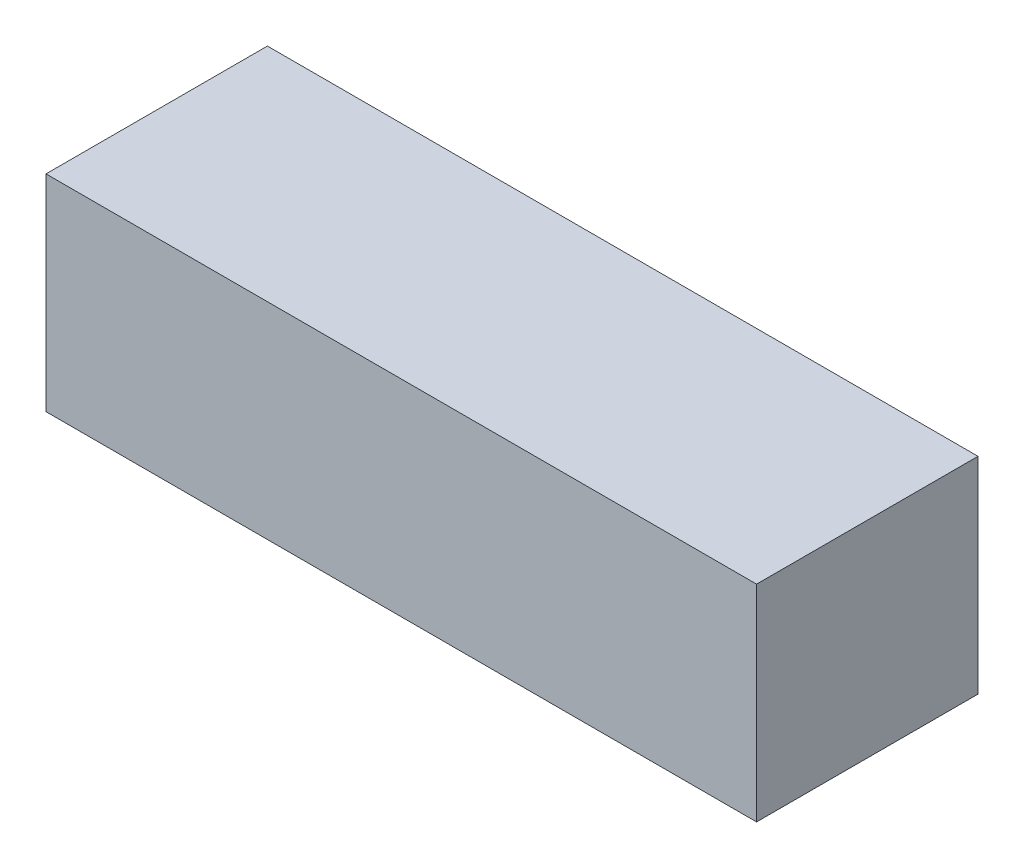
ISO-10303-21;
HEADER;
FILE_DESCRIPTION(('STEP AP214'),'2;1');
FILE_NAME('part.step','',(''),(''),'','','');
FILE_SCHEMA(('AUTOMOTIVE_DESIGN { 1 0 10303 214 1 1 1 1 }'));
ENDSEC;
DATA;
#1=APPLICATION_CONTEXT('core data for automotive mechanical design processes');
#2=APPLICATION_PROTOCOL_DEFINITION('international standard','automotive_design',2000,#1);
#3=PRODUCT_CONTEXT('',#1,'mechanical');
#4=PRODUCT('Part','Part','',(#3));
#5=PRODUCT_RELATED_PRODUCT_CATEGORY('part','',(#4));
#6=PRODUCT_DEFINITION_FORMATION('','',#4);
#7=PRODUCT_DEFINITION_CONTEXT('part definition',#1,'design');
#8=PRODUCT_DEFINITION('design','',#6,#7);
#9=PRODUCT_DEFINITION_SHAPE('','',#8);
#10=(LENGTH_UNIT() NAMED_UNIT(*) SI_UNIT(.MILLI.,.METRE.));
#11=(NAMED_UNIT(*) PLANE_ANGLE_UNIT() SI_UNIT($,.RADIAN.));
#12=(NAMED_UNIT(*) SI_UNIT($,.STERADIAN.) SOLID_ANGLE_UNIT());
#13=UNCERTAINTY_MEASURE_WITH_UNIT(LENGTH_MEASURE(1.E-05),#10,'distance_accuracy_value','');
#14=(GEOMETRIC_REPRESENTATION_CONTEXT(3) GLOBAL_UNCERTAINTY_ASSIGNED_CONTEXT((#13)) GLOBAL_UNIT_ASSIGNED_CONTEXT((#10,
#11,#12)) REPRESENTATION_CONTEXT('',''));
#15=CARTESIAN_POINT('',(0.,0.,0.));
#16=DIRECTION('',(0.,0.,1.));
#17=DIRECTION('',(1.,0.,0.));
#18=AXIS2_PLACEMENT_3D('',#15,#16,#17);
#19=CARTESIAN_POINT('',(-70.,-22.,60.));
#20=DIRECTION('',(0.,1.,0.));
#21=DIRECTION('',(0.,0.,1.));
#22=AXIS2_PLACEMENT_3D('',#19,#20,#21);
#23=PLANE('',#22);
#24=DIRECTION('',(0.,0.,1.));
#25=VECTOR('',#24,1.);
#26=CARTESIAN_POINT('',(68.,-22.,60.));
#27=LINE('',#26,#25);
#28=CARTESIAN_POINT('',(68.,-22.,17.));
#29=VERTEX_POINT('',#28);
#30=CARTESIAN_POINT('',(68.,-22.,60.));
#31=VERTEX_POINT('',#30);
#32=EDGE_CURVE('E91',#29,#31,#27,.T.);
#33=ORIENTED_EDGE('',*,*,#32,.T.);
#34=DIRECTION('',(-1.,0.,0.));
#35=VECTOR('',#34,1.);
#36=CARTESIAN_POINT('',(0.,-22.,60.));
#37=LINE('',#36,#35);
#38=CARTESIAN_POINT('',(-70.,-22.,60.));
#39=VERTEX_POINT('',#38);
#40=EDGE_CURVE('E84',#31,#39,#37,.T.);
#41=ORIENTED_EDGE('',*,*,#40,.T.);
#42=DIRECTION('',(0.,0.,-1.));
#43=VECTOR('',#42,1.);
#44=CARTESIAN_POINT('',(-70.,-22.,60.));
#45=LINE('',#44,#43);
#46=CARTESIAN_POINT('',(-70.,-22.,17.));
#47=VERTEX_POINT('',#46);
#48=EDGE_CURVE('E90',#39,#47,#45,.T.);
#49=ORIENTED_EDGE('',*,*,#48,.T.);
#50=DIRECTION('',(-1.,0.,0.));
#51=VECTOR('',#50,1.);
#52=CARTESIAN_POINT('',(-70.,-22.,17.));
#53=LINE('',#52,#51);
#54=EDGE_CURVE('E109',#29,#47,#53,.T.);
#55=ORIENTED_EDGE('',*,*,#54,.F.);
#56=EDGE_LOOP('',(#33,#41,#49,#55));
#57=FACE_BOUND('',#56,.T.);
#58=ADVANCED_FACE('F46',(#57),#23,.F.);
#59=CARTESIAN_POINT('',(68.,-22.,60.));
#60=DIRECTION('',(-1.,0.,0.));
#61=DIRECTION('',(0.,0.,1.));
#62=AXIS2_PLACEMENT_3D('',#59,#60,#61);
#63=PLANE('',#62);
#64=DIRECTION('',(0.,0.,1.));
#65=VECTOR('',#64,1.);
#66=CARTESIAN_POINT('',(68.,18.,60.));
#67=LINE('',#66,#65);
#68=CARTESIAN_POINT('',(68.,18.,17.));
#69=VERTEX_POINT('',#68);
#70=CARTESIAN_POINT('',(68.,18.,60.));
#71=VERTEX_POINT('',#70);
#72=EDGE_CURVE('E108',#69,#71,#67,.T.);
#73=ORIENTED_EDGE('',*,*,#72,.T.);
#74=DIRECTION('',(0.,-1.,0.));
#75=VECTOR('',#74,1.);
#76=CARTESIAN_POINT('',(68.,-22.,60.));
#77=LINE('',#76,#75);
#78=EDGE_CURVE('E50',#71,#31,#77,.T.);
#79=ORIENTED_EDGE('',*,*,#78,.T.);
#80=ORIENTED_EDGE('',*,*,#32,.F.);
#81=DIRECTION('',(0.,-1.,0.));
#82=VECTOR('',#81,1.);
#83=CARTESIAN_POINT('',(68.,-22.,17.));
#84=LINE('',#83,#82);
#85=EDGE_CURVE('E99',#69,#29,#84,.T.);
#86=ORIENTED_EDGE('',*,*,#85,.F.);
#87=EDGE_LOOP('',(#73,#79,#80,#86));
#88=FACE_BOUND('',#87,.T.);
#89=ADVANCED_FACE('F48',(#88),#63,.F.);
#90=CARTESIAN_POINT('',(0.,0.,60.));
#91=DIRECTION('',(0.,0.,-1.));
#92=DIRECTION('',(-1.,0.,0.));
#93=AXIS2_PLACEMENT_3D('',#90,#91,#92);
#94=PLANE('',#93);
#95=DIRECTION('',(-1.,0.,0.));
#96=VECTOR('',#95,1.);
#97=CARTESIAN_POINT('',(0.,18.,60.));
#98=LINE('',#97,#96);
#99=CARTESIAN_POINT('',(-70.,18.,60.));
#100=VERTEX_POINT('',#99);
#101=EDGE_CURVE('E104',#71,#100,#98,.T.);
#102=ORIENTED_EDGE('',*,*,#101,.T.);
#103=DIRECTION('',(0.,1.,0.));
#104=VECTOR('',#103,1.);
#105=CARTESIAN_POINT('',(-70.,-22.,60.));
#106=LINE('',#105,#104);
#107=EDGE_CURVE('E97',#100,#39,#106,.F.);
#108=ORIENTED_EDGE('',*,*,#107,.T.);
#109=ORIENTED_EDGE('',*,*,#40,.F.);
#110=ORIENTED_EDGE('',*,*,#78,.F.);
#111=EDGE_LOOP('',(#102,#108,#109,#110));
#112=FACE_BOUND('',#111,.T.);
#113=ADVANCED_FACE('F102',(#112),#94,.F.);
#114=CARTESIAN_POINT('',(-70.,-22.,60.));
#115=DIRECTION('',(1.,0.,0.));
#116=DIRECTION('',(0.,0.,-1.));
#117=AXIS2_PLACEMENT_3D('',#114,#115,#116);
#118=PLANE('',#117);
#119=ORIENTED_EDGE('',*,*,#48,.F.);
#120=ORIENTED_EDGE('',*,*,#107,.F.);
#121=DIRECTION('',(0.,0.,-1.));
#122=VECTOR('',#121,1.);
#123=CARTESIAN_POINT('',(-70.,18.,60.));
#124=LINE('',#123,#122);
#125=CARTESIAN_POINT('',(-70.,18.,17.));
#126=VERTEX_POINT('',#125);
#127=EDGE_CURVE('E56',#100,#126,#124,.T.);
#128=ORIENTED_EDGE('',*,*,#127,.T.);
#129=DIRECTION('',(0.,1.,0.));
#130=VECTOR('',#129,1.);
#131=CARTESIAN_POINT('',(-70.,-22.,17.));
#132=LINE('',#131,#130);
#133=EDGE_CURVE('E64',#47,#126,#132,.T.);
#134=ORIENTED_EDGE('',*,*,#133,.F.);
#135=EDGE_LOOP('',(#119,#120,#128,#134));
#136=FACE_BOUND('',#135,.T.);
#137=ADVANCED_FACE('F95',(#136),#118,.F.);
#138=CARTESIAN_POINT('',(0.,0.,17.));
#139=DIRECTION('',(0.,0.,-1.));
#140=DIRECTION('',(-1.,0.,0.));
#141=AXIS2_PLACEMENT_3D('',#138,#139,#140);
#142=PLANE('',#141);
#143=ORIENTED_EDGE('',*,*,#133,.T.);
#144=DIRECTION('',(1.,0.,0.));
#145=VECTOR('',#144,1.);
#146=CARTESIAN_POINT('',(-70.,18.,17.));
#147=LINE('',#146,#145);
#148=EDGE_CURVE('E12',#126,#69,#147,.T.);
#149=ORIENTED_EDGE('',*,*,#148,.T.);
#150=ORIENTED_EDGE('',*,*,#85,.T.);
#151=ORIENTED_EDGE('',*,*,#54,.T.);
#152=EDGE_LOOP('',(#143,#149,#150,#151));
#153=FACE_BOUND('',#152,.T.);
#154=ADVANCED_FACE('F117',(#153),#142,.T.);
#155=CARTESIAN_POINT('',(-70.,18.,60.));
#156=DIRECTION('',(0.,-1.,0.));
#157=DIRECTION('',(0.,0.,-1.));
#158=AXIS2_PLACEMENT_3D('',#155,#156,#157);
#159=PLANE('',#158);
#160=ORIENTED_EDGE('',*,*,#127,.F.);
#161=ORIENTED_EDGE('',*,*,#101,.F.);
#162=ORIENTED_EDGE('',*,*,#72,.F.);
#163=ORIENTED_EDGE('',*,*,#148,.F.);
#164=EDGE_LOOP('',(#160,#161,#162,#163));
#165=FACE_BOUND('',#164,.T.);
#166=ADVANCED_FACE('F120',(#165),#159,.F.);
#167=CLOSED_SHELL('',(#58,#89,#113,#137,#154,#166));
#168=MANIFOLD_SOLID_BREP('B2',#167);
#169=ADVANCED_BREP_SHAPE_REPRESENTATION('',(#18,#168),#14);
#170=SHAPE_DEFINITION_REPRESENTATION(#9,#169);
ENDSEC;
END-ISO-10303-21;
